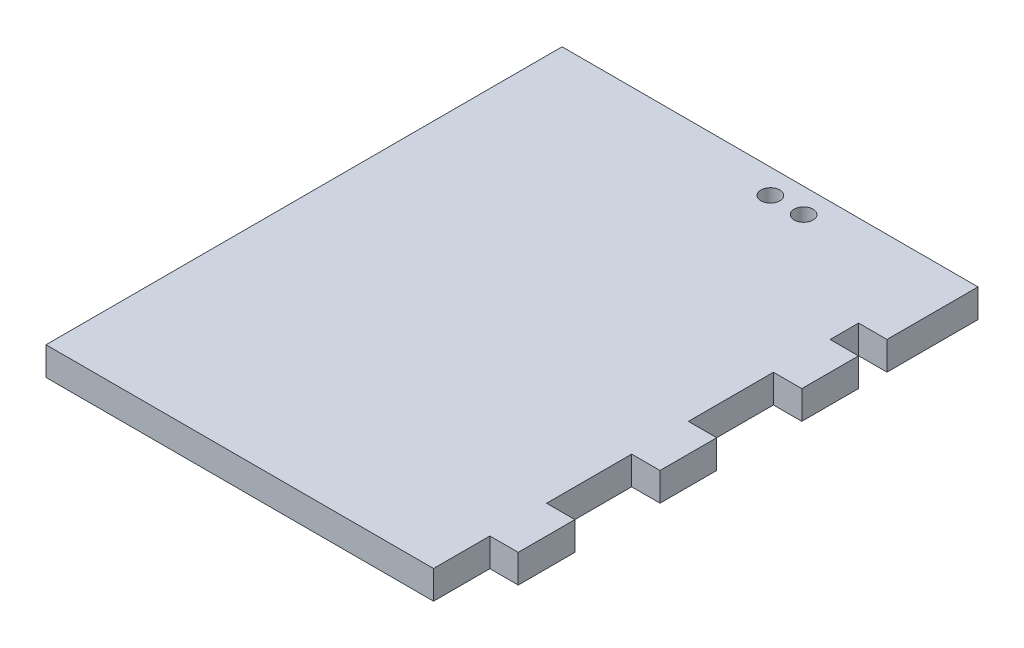
ISO-10303-21;
HEADER;
FILE_DESCRIPTION(('STEP AP214'),'2;1');
FILE_NAME('part.step','',(''),(''),'','','');
FILE_SCHEMA(('AUTOMOTIVE_DESIGN { 1 0 10303 214 1 1 1 1 }'));
ENDSEC;
DATA;
#1=APPLICATION_CONTEXT('core data for automotive mechanical design processes');
#2=APPLICATION_PROTOCOL_DEFINITION('international standard','automotive_design',2000,#1);
#3=PRODUCT_CONTEXT('',#1,'mechanical');
#4=PRODUCT('Part','Part','',(#3));
#5=PRODUCT_RELATED_PRODUCT_CATEGORY('part','',(#4));
#6=PRODUCT_DEFINITION_FORMATION('','',#4);
#7=PRODUCT_DEFINITION_CONTEXT('part definition',#1,'design');
#8=PRODUCT_DEFINITION('design','',#6,#7);
#9=PRODUCT_DEFINITION_SHAPE('','',#8);
#10=(LENGTH_UNIT() NAMED_UNIT(*) SI_UNIT(.MILLI.,.METRE.));
#11=(NAMED_UNIT(*) PLANE_ANGLE_UNIT() SI_UNIT($,.RADIAN.));
#12=(NAMED_UNIT(*) SI_UNIT($,.STERADIAN.) SOLID_ANGLE_UNIT());
#13=UNCERTAINTY_MEASURE_WITH_UNIT(LENGTH_MEASURE(1.E-05),#10,'distance_accuracy_value','');
#14=(GEOMETRIC_REPRESENTATION_CONTEXT(3) GLOBAL_UNCERTAINTY_ASSIGNED_CONTEXT((#13)) GLOBAL_UNIT_ASSIGNED_CONTEXT((#10,
#11,#12)) REPRESENTATION_CONTEXT('',''));
#15=CARTESIAN_POINT('',(0.,0.,0.));
#16=DIRECTION('',(0.,0.,1.));
#17=DIRECTION('',(1.,0.,0.));
#18=AXIS2_PLACEMENT_3D('',#15,#16,#17);
#19=CARTESIAN_POINT('',(22.,3.,-27.3));
#20=DIRECTION('',(-1.,0.,0.));
#21=DIRECTION('',(0.,0.,1.));
#22=AXIS2_PLACEMENT_3D('',#19,#20,#21);
#23=PLANE('',#22);
#24=DIRECTION('',(0.,0.,-1.));
#25=VECTOR('',#24,1.);
#26=CARTESIAN_POINT('',(22.,3.,-27.3));
#27=LINE('',#26,#25);
#28=CARTESIAN_POINT('',(22.,3.,-17.6703269537768));
#29=VERTEX_POINT('',#28);
#30=CARTESIAN_POINT('',(22.,3.,-27.3));
#31=VERTEX_POINT('',#30);
#32=EDGE_CURVE('E195',#29,#31,#27,.T.);
#33=ORIENTED_EDGE('',*,*,#32,.F.);
#34=DIRECTION('',(0.,-1.,0.));
#35=VECTOR('',#34,1.);
#36=CARTESIAN_POINT('',(22.,3.,-17.6703269537768));
#37=LINE('',#36,#35);
#38=CARTESIAN_POINT('',(22.,0.,-17.6703269537768));
#39=VERTEX_POINT('',#38);
#40=EDGE_CURVE('E11',#29,#39,#37,.T.);
#41=ORIENTED_EDGE('',*,*,#40,.T.);
#42=DIRECTION('',(0.,0.,-1.));
#43=VECTOR('',#42,1.);
#44=CARTESIAN_POINT('',(22.,0.,-27.3));
#45=LINE('',#44,#43);
#46=CARTESIAN_POINT('',(22.,0.,-27.3));
#47=VERTEX_POINT('',#46);
#48=EDGE_CURVE('E179',#39,#47,#45,.T.);
#49=ORIENTED_EDGE('',*,*,#48,.T.);
#50=DIRECTION('',(0.,-1.,0.));
#51=VECTOR('',#50,1.);
#52=CARTESIAN_POINT('',(22.,3.,-27.3));
#53=LINE('',#52,#51);
#54=EDGE_CURVE('E202',#31,#47,#53,.T.);
#55=ORIENTED_EDGE('',*,*,#54,.F.);
#56=EDGE_LOOP('',(#33,#41,#49,#55));
#57=FACE_BOUND('',#56,.T.);
#58=ADVANCED_FACE('F33',(#57),#23,.F.);
#59=CARTESIAN_POINT('',(22.,0.,21.3411489454701));
#60=VERTEX_POINT('',#59);
#61=CARTESIAN_POINT('',(22.,0.,15.3411489454701));
#62=VERTEX_POINT('',#61);
#63=EDGE_CURVE('E182',#60,#62,#45,.T.);
#64=ORIENTED_EDGE('',*,*,#63,.T.);
#65=DIRECTION('',(0.,1.,0.));
#66=VECTOR('',#65,1.);
#67=CARTESIAN_POINT('',(22.,3.,15.3411489454701));
#68=LINE('',#67,#66);
#69=CARTESIAN_POINT('',(22.,3.,15.3411489454701));
#70=VERTEX_POINT('',#69);
#71=EDGE_CURVE('E165',#62,#70,#68,.T.);
#72=ORIENTED_EDGE('',*,*,#71,.T.);
#73=CARTESIAN_POINT('',(22.,3.,21.3411489454701));
#74=VERTEX_POINT('',#73);
#75=EDGE_CURVE('E222',#74,#70,#27,.T.);
#76=ORIENTED_EDGE('',*,*,#75,.F.);
#77=DIRECTION('',(0.,-1.,0.));
#78=VECTOR('',#77,1.);
#79=CARTESIAN_POINT('',(22.,10.,21.3411489454701));
#80=LINE('',#79,#78);
#81=EDGE_CURVE('E175',#74,#60,#80,.T.);
#82=ORIENTED_EDGE('',*,*,#81,.T.);
#83=EDGE_LOOP('',(#64,#72,#76,#82));
#84=FACE_BOUND('',#83,.T.);
#85=ADVANCED_FACE('F220',(#84),#23,.F.);
#86=CARTESIAN_POINT('',(22.,3.,6.34114894547008));
#87=VERTEX_POINT('',#86);
#88=CARTESIAN_POINT('',(22.,3.,0.341148945470077));
#89=VERTEX_POINT('',#88);
#90=EDGE_CURVE('E238',#87,#89,#27,.T.);
#91=ORIENTED_EDGE('',*,*,#90,.F.);
#92=DIRECTION('',(0.,-1.,0.));
#93=VECTOR('',#92,1.);
#94=CARTESIAN_POINT('',(22.,3.,6.34114894547008));
#95=LINE('',#94,#93);
#96=CARTESIAN_POINT('',(22.,0.,6.34114894547008));
#97=VERTEX_POINT('',#96);
#98=EDGE_CURVE('E212',#87,#97,#95,.T.);
#99=ORIENTED_EDGE('',*,*,#98,.T.);
#100=CARTESIAN_POINT('',(22.,0.,0.341148945470077));
#101=VERTEX_POINT('',#100);
#102=EDGE_CURVE('E178',#97,#101,#45,.T.);
#103=ORIENTED_EDGE('',*,*,#102,.T.);
#104=DIRECTION('',(0.,1.,0.));
#105=VECTOR('',#104,1.);
#106=CARTESIAN_POINT('',(22.,3.,0.341148945470077));
#107=LINE('',#106,#105);
#108=EDGE_CURVE('E209',#101,#89,#107,.T.);
#109=ORIENTED_EDGE('',*,*,#108,.T.);
#110=EDGE_LOOP('',(#91,#99,#103,#109));
#111=FACE_BOUND('',#110,.T.);
#112=ADVANCED_FACE('F306',(#111),#23,.F.);
#113=CARTESIAN_POINT('',(0.,3.,0.));
#114=DIRECTION('',(0.,1.,0.));
#115=DIRECTION('',(0.,0.,1.));
#116=AXIS2_PLACEMENT_3D('',#113,#114,#115);
#117=PLANE('',#116);
#118=DIRECTION('',(-1.,0.,0.));
#119=VECTOR('',#118,1.);
#120=CARTESIAN_POINT('',(0.,3.,-17.6703269537768));
#121=LINE('',#120,#119);
#122=CARTESIAN_POINT('',(18.9999999999954,3.,-17.6703269537768));
#123=VERTEX_POINT('',#122);
#124=EDGE_CURVE('E265',#29,#123,#121,.T.);
#125=ORIENTED_EDGE('',*,*,#124,.F.);
#126=ORIENTED_EDGE('',*,*,#32,.T.);
#127=DIRECTION('',(-1.,0.,0.));
#128=VECTOR('',#127,1.);
#129=CARTESIAN_POINT('',(-22.,3.,-27.3));
#130=LINE('',#129,#128);
#131=CARTESIAN_POINT('',(-22.,3.,-27.3));
#132=VERTEX_POINT('',#131);
#133=EDGE_CURVE('E237',#31,#132,#130,.T.);
#134=ORIENTED_EDGE('',*,*,#133,.T.);
#135=DIRECTION('',(0.,0.,1.));
#136=VECTOR('',#135,1.);
#137=CARTESIAN_POINT('',(-22.,3.,-27.3));
#138=LINE('',#137,#136);
#139=CARTESIAN_POINT('',(-22.,3.,27.3));
#140=VERTEX_POINT('',#139);
#141=EDGE_CURVE('E240',#132,#140,#138,.T.);
#142=ORIENTED_EDGE('',*,*,#141,.T.);
#143=DIRECTION('',(1.,0.,0.));
#144=VECTOR('',#143,1.);
#145=CARTESIAN_POINT('',(-22.,3.,27.3));
#146=LINE('',#145,#144);
#147=CARTESIAN_POINT('',(18.9999999999954,3.,27.3));
#148=VERTEX_POINT('',#147);
#149=EDGE_CURVE('E186',#140,#148,#146,.T.);
#150=ORIENTED_EDGE('',*,*,#149,.T.);
#151=DIRECTION('',(0.,0.,1.));
#152=VECTOR('',#151,1.);
#153=CARTESIAN_POINT('',(18.9999999999954,3.,0.));
#154=LINE('',#153,#152);
#155=CARTESIAN_POINT('',(18.9999999999954,3.,21.3411489454701));
#156=VERTEX_POINT('',#155);
#157=EDGE_CURVE('E258',#156,#148,#154,.T.);
#158=ORIENTED_EDGE('',*,*,#157,.F.);
#159=DIRECTION('',(-1.,0.,0.));
#160=VECTOR('',#159,1.);
#161=CARTESIAN_POINT('',(0.,3.,21.3411489454701));
#162=LINE('',#161,#160);
#163=EDGE_CURVE('E236',#74,#156,#162,.T.);
#164=ORIENTED_EDGE('',*,*,#163,.F.);
#165=ORIENTED_EDGE('',*,*,#75,.T.);
#166=DIRECTION('',(1.,0.,0.));
#167=VECTOR('',#166,1.);
#168=CARTESIAN_POINT('',(0.,3.,15.3411489454701));
#169=LINE('',#168,#167);
#170=CARTESIAN_POINT('',(18.9999999999954,3.,15.3411489454701));
#171=VERTEX_POINT('',#170);
#172=EDGE_CURVE('E234',#171,#70,#169,.T.);
#173=ORIENTED_EDGE('',*,*,#172,.F.);
#174=DIRECTION('',(0.,0.,1.));
#175=VECTOR('',#174,1.);
#176=CARTESIAN_POINT('',(18.9999999999954,3.,0.));
#177=LINE('',#176,#175);
#178=CARTESIAN_POINT('',(18.9999999999954,3.,6.34114894547008));
#179=VERTEX_POINT('',#178);
#180=EDGE_CURVE('E268',#179,#171,#177,.T.);
#181=ORIENTED_EDGE('',*,*,#180,.F.);
#182=DIRECTION('',(-1.,0.,0.));
#183=VECTOR('',#182,1.);
#184=CARTESIAN_POINT('',(0.,3.,6.34114894547012));
#185=LINE('',#184,#183);
#186=EDGE_CURVE('E256',#87,#179,#185,.T.);
#187=ORIENTED_EDGE('',*,*,#186,.F.);
#188=ORIENTED_EDGE('',*,*,#90,.T.);
#189=DIRECTION('',(1.,0.,0.));
#190=VECTOR('',#189,1.);
#191=CARTESIAN_POINT('',(0.,3.,0.341148945470077));
#192=LINE('',#191,#190);
#193=CARTESIAN_POINT('',(18.9999999999954,3.,0.341148945470077));
#194=VERTEX_POINT('',#193);
#195=EDGE_CURVE('E254',#194,#89,#192,.T.);
#196=ORIENTED_EDGE('',*,*,#195,.F.);
#197=DIRECTION('',(0.,0.,1.));
#198=VECTOR('',#197,1.);
#199=CARTESIAN_POINT('',(18.9999999999954,3.,0.));
#200=LINE('',#199,#198);
#201=CARTESIAN_POINT('',(18.9999999999954,3.,-8.65885105452992));
#202=VERTEX_POINT('',#201);
#203=EDGE_CURVE('E252',#202,#194,#200,.T.);
#204=ORIENTED_EDGE('',*,*,#203,.F.);
#205=DIRECTION('',(-1.,0.,0.));
#206=VECTOR('',#205,1.);
#207=CARTESIAN_POINT('',(0.,3.,-8.6588510545299));
#208=LINE('',#207,#206);
#209=CARTESIAN_POINT('',(22.,3.,-8.65885105452992));
#210=VERTEX_POINT('',#209);
#211=EDGE_CURVE('E250',#210,#202,#208,.T.);
#212=ORIENTED_EDGE('',*,*,#211,.F.);
#213=CARTESIAN_POINT('',(22.,3.,-14.6588510545299));
#214=VERTEX_POINT('',#213);
#215=EDGE_CURVE('E243',#210,#214,#27,.T.);
#216=ORIENTED_EDGE('',*,*,#215,.T.);
#217=DIRECTION('',(1.,0.,0.));
#218=VECTOR('',#217,1.);
#219=CARTESIAN_POINT('',(0.,3.,-14.6588510545299));
#220=LINE('',#219,#218);
#221=CARTESIAN_POINT('',(18.9999999999954,3.,-14.6588510545299));
#222=VERTEX_POINT('',#221);
#223=EDGE_CURVE('E48',#222,#214,#220,.T.);
#224=ORIENTED_EDGE('',*,*,#223,.F.);
#225=DIRECTION('',(0.,0.,1.));
#226=VECTOR('',#225,1.);
#227=CARTESIAN_POINT('',(18.9999999999954,3.,0.));
#228=LINE('',#227,#226);
#229=EDGE_CURVE('E270',#123,#222,#228,.T.);
#230=ORIENTED_EDGE('',*,*,#229,.F.);
#231=EDGE_LOOP('',(#125,#126,#134,#142,#150,#158,#164,#165,#173,#181,#187,#188,#196,#204,#212,
#216,#224,#230));
#232=FACE_BOUND('',#231,.T.);
#233=CARTESIAN_POINT('',(2.63698490091233,3.,-24.7));
#234=DIRECTION('',(0.,1.,0.));
#235=DIRECTION('',(0.,0.,1.));
#236=AXIS2_PLACEMENT_3D('',#233,#234,#235);
#237=CIRCLE('',#236,0.999999999999998);
#238=CARTESIAN_POINT('',(2.63698490091233,3.,-23.7));
#239=VERTEX_POINT('',#238);
#240=EDGE_CURVE('E183',#239,#239,#237,.T.);
#241=ORIENTED_EDGE('',*,*,#240,.F.);
#242=EDGE_LOOP('',(#241));
#243=FACE_BOUND('',#242,.T.);
#244=CARTESIAN_POINT('',(6.15000000000007,3.,-24.7));
#245=DIRECTION('',(0.,1.,0.));
#246=DIRECTION('',(0.,0.,1.));
#247=AXIS2_PLACEMENT_3D('',#244,#245,#246);
#248=CIRCLE('',#247,0.999999999999998);
#249=CARTESIAN_POINT('',(6.15000000000007,3.,-23.7));
#250=VERTEX_POINT('',#249);
#251=EDGE_CURVE('E273',#250,#250,#248,.T.);
#252=ORIENTED_EDGE('',*,*,#251,.F.);
#253=EDGE_LOOP('',(#252));
#254=FACE_BOUND('',#253,.T.);
#255=ADVANCED_FACE('F231',(#232,#243,#254),#117,.T.);
#256=CARTESIAN_POINT('',(0.,0.,0.));
#257=DIRECTION('',(0.,1.,0.));
#258=DIRECTION('',(0.,0.,1.));
#259=AXIS2_PLACEMENT_3D('',#256,#257,#258);
#260=PLANE('',#259);
#261=ORIENTED_EDGE('',*,*,#48,.F.);
#262=DIRECTION('',(1.,0.,0.));
#263=VECTOR('',#262,1.);
#264=CARTESIAN_POINT('',(22.,0.,-17.6703269537768));
#265=LINE('',#264,#263);
#266=CARTESIAN_POINT('',(18.9999999999954,0.,-17.6703269537768));
#267=VERTEX_POINT('',#266);
#268=EDGE_CURVE('E366',#267,#39,#265,.T.);
#269=ORIENTED_EDGE('',*,*,#268,.F.);
#270=DIRECTION('',(0.,0.,-1.));
#271=VECTOR('',#270,1.);
#272=CARTESIAN_POINT('',(18.9999999999954,0.,-17.6703269537768));
#273=LINE('',#272,#271);
#274=CARTESIAN_POINT('',(18.9999999999954,0.,-14.6588510545299));
#275=VERTEX_POINT('',#274);
#276=EDGE_CURVE('E174',#275,#267,#273,.T.);
#277=ORIENTED_EDGE('',*,*,#276,.F.);
#278=DIRECTION('',(-1.,0.,0.));
#279=VECTOR('',#278,1.);
#280=CARTESIAN_POINT('',(22.,0.,-14.6588510545299));
#281=LINE('',#280,#279);
#282=CARTESIAN_POINT('',(22.,0.,-14.6588510545299));
#283=VERTEX_POINT('',#282);
#284=EDGE_CURVE('E159',#283,#275,#281,.T.);
#285=ORIENTED_EDGE('',*,*,#284,.F.);
#286=CARTESIAN_POINT('',(22.,0.,-8.65885105452992));
#287=VERTEX_POINT('',#286);
#288=EDGE_CURVE('E171',#287,#283,#45,.T.);
#289=ORIENTED_EDGE('',*,*,#288,.F.);
#290=DIRECTION('',(1.,0.,0.));
#291=VECTOR('',#290,1.);
#292=CARTESIAN_POINT('',(18.9999999999954,0.,-8.65885105452992));
#293=LINE('',#292,#291);
#294=CARTESIAN_POINT('',(18.9999999999954,0.,-8.65885105452992));
#295=VERTEX_POINT('',#294);
#296=EDGE_CURVE('E56',#295,#287,#293,.T.);
#297=ORIENTED_EDGE('',*,*,#296,.F.);
#298=DIRECTION('',(0.,0.,-1.));
#299=VECTOR('',#298,1.);
#300=CARTESIAN_POINT('',(18.9999999999954,0.,-8.65885105452992));
#301=LINE('',#300,#299);
#302=CARTESIAN_POINT('',(18.9999999999954,0.,0.341148945470077));
#303=VERTEX_POINT('',#302);
#304=EDGE_CURVE('E337',#303,#295,#301,.T.);
#305=ORIENTED_EDGE('',*,*,#304,.F.);
#306=DIRECTION('',(-1.,0.,0.));
#307=VECTOR('',#306,1.);
#308=CARTESIAN_POINT('',(22.,0.,0.341148945470077));
#309=LINE('',#308,#307);
#310=EDGE_CURVE('E354',#101,#303,#309,.T.);
#311=ORIENTED_EDGE('',*,*,#310,.F.);
#312=ORIENTED_EDGE('',*,*,#102,.F.);
#313=DIRECTION('',(1.,0.,0.));
#314=VECTOR('',#313,1.);
#315=CARTESIAN_POINT('',(18.9999999999954,0.,6.34114894547008));
#316=LINE('',#315,#314);
#317=CARTESIAN_POINT('',(18.9999999999954,0.,6.34114894547008));
#318=VERTEX_POINT('',#317);
#319=EDGE_CURVE('E339',#318,#97,#316,.T.);
#320=ORIENTED_EDGE('',*,*,#319,.F.);
#321=DIRECTION('',(0.,0.,-1.));
#322=VECTOR('',#321,1.);
#323=CARTESIAN_POINT('',(18.9999999999954,0.,6.34114894547008));
#324=LINE('',#323,#322);
#325=CARTESIAN_POINT('',(18.9999999999954,0.,15.3411489454701));
#326=VERTEX_POINT('',#325);
#327=EDGE_CURVE('E332',#326,#318,#324,.T.);
#328=ORIENTED_EDGE('',*,*,#327,.F.);
#329=DIRECTION('',(-1.,0.,0.));
#330=VECTOR('',#329,1.);
#331=CARTESIAN_POINT('',(22.,0.,15.3411489454701));
#332=LINE('',#331,#330);
#333=EDGE_CURVE('E335',#62,#326,#332,.T.);
#334=ORIENTED_EDGE('',*,*,#333,.F.);
#335=ORIENTED_EDGE('',*,*,#63,.F.);
#336=DIRECTION('',(1.,0.,0.));
#337=VECTOR('',#336,1.);
#338=CARTESIAN_POINT('',(18.9999999999954,0.,21.3411489454701));
#339=LINE('',#338,#337);
#340=CARTESIAN_POINT('',(18.9999999999954,0.,21.3411489454701));
#341=VERTEX_POINT('',#340);
#342=EDGE_CURVE('E345',#341,#60,#339,.T.);
#343=ORIENTED_EDGE('',*,*,#342,.F.);
#344=DIRECTION('',(0.,0.,-1.));
#345=VECTOR('',#344,1.);
#346=CARTESIAN_POINT('',(18.9999999999954,0.,21.3411489454701));
#347=LINE('',#346,#345);
#348=CARTESIAN_POINT('',(18.9999999999954,0.,27.3));
#349=VERTEX_POINT('',#348);
#350=EDGE_CURVE('E342',#349,#341,#347,.T.);
#351=ORIENTED_EDGE('',*,*,#350,.F.);
#352=DIRECTION('',(1.,0.,0.));
#353=VECTOR('',#352,1.);
#354=CARTESIAN_POINT('',(-22.,0.,27.3));
#355=LINE('',#354,#353);
#356=CARTESIAN_POINT('',(-22.,0.,27.3));
#357=VERTEX_POINT('',#356);
#358=EDGE_CURVE('E192',#357,#349,#355,.T.);
#359=ORIENTED_EDGE('',*,*,#358,.F.);
#360=DIRECTION('',(0.,0.,1.));
#361=VECTOR('',#360,1.);
#362=CARTESIAN_POINT('',(-22.,0.,-27.3));
#363=LINE('',#362,#361);
#364=CARTESIAN_POINT('',(-22.,0.,-27.3));
#365=VERTEX_POINT('',#364);
#366=EDGE_CURVE('E190',#365,#357,#363,.T.);
#367=ORIENTED_EDGE('',*,*,#366,.F.);
#368=DIRECTION('',(-1.,0.,0.));
#369=VECTOR('',#368,1.);
#370=CARTESIAN_POINT('',(-22.,0.,-27.3));
#371=LINE('',#370,#369);
#372=EDGE_CURVE('E188',#47,#365,#371,.T.);
#373=ORIENTED_EDGE('',*,*,#372,.F.);
#374=EDGE_LOOP('',(#261,#269,#277,#285,#289,#297,#305,#311,#312,#320,#328,#334,#335,#343,#351,
#359,#367,#373));
#375=FACE_BOUND('',#374,.T.);
#376=CARTESIAN_POINT('',(2.63698490091233,0.,-24.7));
#377=DIRECTION('',(0.,1.,0.));
#378=DIRECTION('',(0.,0.,1.));
#379=AXIS2_PLACEMENT_3D('',#376,#377,#378);
#380=CIRCLE('',#379,0.999999999999998);
#381=CARTESIAN_POINT('',(2.63698490091233,0.,-23.7));
#382=VERTEX_POINT('',#381);
#383=EDGE_CURVE('E276',#382,#382,#380,.T.);
#384=ORIENTED_EDGE('',*,*,#383,.T.);
#385=EDGE_LOOP('',(#384));
#386=FACE_BOUND('',#385,.T.);
#387=CARTESIAN_POINT('',(6.15000000000007,0.,-24.7));
#388=DIRECTION('',(0.,1.,0.));
#389=DIRECTION('',(0.,0.,1.));
#390=AXIS2_PLACEMENT_3D('',#387,#388,#389);
#391=CIRCLE('',#390,0.999999999999998);
#392=CARTESIAN_POINT('',(6.15000000000007,0.,-23.7));
#393=VERTEX_POINT('',#392);
#394=EDGE_CURVE('E272',#393,#393,#391,.T.);
#395=ORIENTED_EDGE('',*,*,#394,.T.);
#396=EDGE_LOOP('',(#395));
#397=FACE_BOUND('',#396,.T.);
#398=ADVANCED_FACE('F169',(#375,#386,#397),#260,.F.);
#399=ORIENTED_EDGE('',*,*,#288,.T.);
#400=DIRECTION('',(0.,1.,0.));
#401=VECTOR('',#400,1.);
#402=CARTESIAN_POINT('',(22.,3.,-14.6588510545299));
#403=LINE('',#402,#401);
#404=EDGE_CURVE('E41',#283,#214,#403,.T.);
#405=ORIENTED_EDGE('',*,*,#404,.T.);
#406=ORIENTED_EDGE('',*,*,#215,.F.);
#407=DIRECTION('',(0.,-1.,0.));
#408=VECTOR('',#407,1.);
#409=CARTESIAN_POINT('',(22.,3.,-8.65885105452992));
#410=LINE('',#409,#408);
#411=EDGE_CURVE('E177',#210,#287,#410,.T.);
#412=ORIENTED_EDGE('',*,*,#411,.T.);
#413=EDGE_LOOP('',(#399,#405,#406,#412));
#414=FACE_BOUND('',#413,.T.);
#415=ADVANCED_FACE('F35',(#414),#23,.F.);
#416=CARTESIAN_POINT('',(-22.,3.,-27.3));
#417=DIRECTION('',(0.,0.,1.));
#418=DIRECTION('',(1.,0.,0.));
#419=AXIS2_PLACEMENT_3D('',#416,#417,#418);
#420=PLANE('',#419);
#421=ORIENTED_EDGE('',*,*,#372,.T.);
#422=DIRECTION('',(0.,-1.,0.));
#423=VECTOR('',#422,1.);
#424=CARTESIAN_POINT('',(-22.,3.,-27.3));
#425=LINE('',#424,#423);
#426=EDGE_CURVE('E199',#132,#365,#425,.T.);
#427=ORIENTED_EDGE('',*,*,#426,.F.);
#428=ORIENTED_EDGE('',*,*,#133,.F.);
#429=ORIENTED_EDGE('',*,*,#54,.T.);
#430=EDGE_LOOP('',(#421,#427,#428,#429));
#431=FACE_BOUND('',#430,.T.);
#432=ADVANCED_FACE('F308',(#431),#420,.F.);
#433=CARTESIAN_POINT('',(-22.,3.,-27.3));
#434=DIRECTION('',(1.,0.,0.));
#435=DIRECTION('',(0.,0.,-1.));
#436=AXIS2_PLACEMENT_3D('',#433,#434,#435);
#437=PLANE('',#436);
#438=ORIENTED_EDGE('',*,*,#366,.T.);
#439=DIRECTION('',(0.,-1.,0.));
#440=VECTOR('',#439,1.);
#441=CARTESIAN_POINT('',(-22.,3.,27.3));
#442=LINE('',#441,#440);
#443=EDGE_CURVE('E196',#140,#357,#442,.T.);
#444=ORIENTED_EDGE('',*,*,#443,.F.);
#445=ORIENTED_EDGE('',*,*,#141,.F.);
#446=ORIENTED_EDGE('',*,*,#426,.T.);
#447=EDGE_LOOP('',(#438,#444,#445,#446));
#448=FACE_BOUND('',#447,.T.);
#449=ADVANCED_FACE('F297',(#448),#437,.F.);
#450=CARTESIAN_POINT('',(-22.,3.,27.3));
#451=DIRECTION('',(0.,0.,-1.));
#452=DIRECTION('',(-1.,0.,0.));
#453=AXIS2_PLACEMENT_3D('',#450,#451,#452);
#454=PLANE('',#453);
#455=ORIENTED_EDGE('',*,*,#358,.T.);
#456=DIRECTION('',(0.,1.,0.));
#457=VECTOR('',#456,1.);
#458=CARTESIAN_POINT('',(18.9999999999954,3.,27.3));
#459=LINE('',#458,#457);
#460=EDGE_CURVE('E205',#349,#148,#459,.T.);
#461=ORIENTED_EDGE('',*,*,#460,.T.);
#462=ORIENTED_EDGE('',*,*,#149,.F.);
#463=ORIENTED_EDGE('',*,*,#443,.T.);
#464=EDGE_LOOP('',(#455,#461,#462,#463));
#465=FACE_BOUND('',#464,.T.);
#466=ADVANCED_FACE('F287',(#465),#454,.F.);
#467=CARTESIAN_POINT('',(2.63698490091233,3.,-24.7));
#468=DIRECTION('',(0.,-1.,0.));
#469=DIRECTION('',(0.,0.,-1.));
#470=AXIS2_PLACEMENT_3D('',#467,#468,#469);
#471=CYLINDRICAL_SURFACE('',#470,0.999999999999998);
#472=ORIENTED_EDGE('',*,*,#240,.T.);
#473=EDGE_LOOP('',(#472));
#474=FACE_BOUND('',#473,.T.);
#475=ORIENTED_EDGE('',*,*,#383,.F.);
#476=EDGE_LOOP('',(#475));
#477=FACE_BOUND('',#476,.T.);
#478=ADVANCED_FACE('F284',(#474,#477),#471,.F.);
#479=CARTESIAN_POINT('',(6.15000000000007,3.,-24.7));
#480=DIRECTION('',(0.,-1.,0.));
#481=DIRECTION('',(0.,0.,-1.));
#482=AXIS2_PLACEMENT_3D('',#479,#480,#481);
#483=CYLINDRICAL_SURFACE('',#482,0.999999999999998);
#484=ORIENTED_EDGE('',*,*,#251,.T.);
#485=EDGE_LOOP('',(#484));
#486=FACE_BOUND('',#485,.T.);
#487=ORIENTED_EDGE('',*,*,#394,.F.);
#488=EDGE_LOOP('',(#487));
#489=FACE_BOUND('',#488,.T.);
#490=ADVANCED_FACE('F286',(#486,#489),#483,.F.);
#491=CARTESIAN_POINT('',(18.9999999999954,10.,21.3411489454701));
#492=DIRECTION('',(0.,0.,-1.));
#493=DIRECTION('',(-1.,0.,0.));
#494=AXIS2_PLACEMENT_3D('',#491,#492,#493);
#495=PLANE('',#494);
#496=ORIENTED_EDGE('',*,*,#163,.T.);
#497=DIRECTION('',(0.,-1.,0.));
#498=VECTOR('',#497,1.);
#499=CARTESIAN_POINT('',(18.9999999999954,10.,21.3411489454701));
#500=LINE('',#499,#498);
#501=EDGE_CURVE('E348',#156,#341,#500,.T.);
#502=ORIENTED_EDGE('',*,*,#501,.T.);
#503=ORIENTED_EDGE('',*,*,#342,.T.);
#504=ORIENTED_EDGE('',*,*,#81,.F.);
#505=EDGE_LOOP('',(#496,#502,#503,#504));
#506=FACE_BOUND('',#505,.T.);
#507=ADVANCED_FACE('F294',(#506),#495,.F.);
#508=CARTESIAN_POINT('',(18.9999999999954,10.,21.3411489454701));
#509=DIRECTION('',(-1.,0.,0.));
#510=DIRECTION('',(0.,0.,1.));
#511=AXIS2_PLACEMENT_3D('',#508,#509,#510);
#512=PLANE('',#511);
#513=ORIENTED_EDGE('',*,*,#157,.T.);
#514=ORIENTED_EDGE('',*,*,#460,.F.);
#515=ORIENTED_EDGE('',*,*,#350,.T.);
#516=ORIENTED_EDGE('',*,*,#501,.F.);
#517=EDGE_LOOP('',(#513,#514,#515,#516));
#518=FACE_BOUND('',#517,.T.);
#519=ADVANCED_FACE('F392',(#518),#512,.F.);
#520=CARTESIAN_POINT('',(18.9999999999954,10.,-8.65885105452992));
#521=DIRECTION('',(-1.,0.,0.));
#522=DIRECTION('',(0.,0.,1.));
#523=AXIS2_PLACEMENT_3D('',#520,#521,#522);
#524=PLANE('',#523);
#525=ORIENTED_EDGE('',*,*,#203,.T.);
#526=DIRECTION('',(0.,-1.,0.));
#527=VECTOR('',#526,1.);
#528=CARTESIAN_POINT('',(18.9999999999954,10.,0.341148945470077));
#529=LINE('',#528,#527);
#530=EDGE_CURVE('E346',#194,#303,#529,.T.);
#531=ORIENTED_EDGE('',*,*,#530,.T.);
#532=ORIENTED_EDGE('',*,*,#304,.T.);
#533=DIRECTION('',(0.,-1.,0.));
#534=VECTOR('',#533,1.);
#535=CARTESIAN_POINT('',(18.9999999999954,10.,-8.65885105452992));
#536=LINE('',#535,#534);
#537=EDGE_CURVE('E357',#202,#295,#536,.T.);
#538=ORIENTED_EDGE('',*,*,#537,.F.);
#539=EDGE_LOOP('',(#525,#531,#532,#538));
#540=FACE_BOUND('',#539,.T.);
#541=ADVANCED_FACE('F378',(#540),#524,.F.);
#542=CARTESIAN_POINT('',(22.,10.,0.341148945470077));
#543=DIRECTION('',(0.,0.,1.));
#544=DIRECTION('',(1.,0.,0.));
#545=AXIS2_PLACEMENT_3D('',#542,#543,#544);
#546=PLANE('',#545);
#547=ORIENTED_EDGE('',*,*,#195,.T.);
#548=ORIENTED_EDGE('',*,*,#108,.F.);
#549=ORIENTED_EDGE('',*,*,#310,.T.);
#550=ORIENTED_EDGE('',*,*,#530,.F.);
#551=EDGE_LOOP('',(#547,#548,#549,#550));
#552=FACE_BOUND('',#551,.T.);
#553=ADVANCED_FACE('F376',(#552),#546,.F.);
#554=CARTESIAN_POINT('',(18.9999999999954,10.,-8.65885105452992));
#555=DIRECTION('',(0.,0.,-1.));
#556=DIRECTION('',(-1.,0.,0.));
#557=AXIS2_PLACEMENT_3D('',#554,#555,#556);
#558=PLANE('',#557);
#559=ORIENTED_EDGE('',*,*,#211,.T.);
#560=ORIENTED_EDGE('',*,*,#537,.T.);
#561=ORIENTED_EDGE('',*,*,#296,.T.);
#562=ORIENTED_EDGE('',*,*,#411,.F.);
#563=EDGE_LOOP('',(#559,#560,#561,#562));
#564=FACE_BOUND('',#563,.T.);
#565=ADVANCED_FACE('F379',(#564),#558,.F.);
#566=CARTESIAN_POINT('',(18.9999999999954,10.,6.34114894547008));
#567=DIRECTION('',(-1.,0.,0.));
#568=DIRECTION('',(0.,0.,1.));
#569=AXIS2_PLACEMENT_3D('',#566,#567,#568);
#570=PLANE('',#569);
#571=ORIENTED_EDGE('',*,*,#180,.T.);
#572=DIRECTION('',(0.,-1.,0.));
#573=VECTOR('',#572,1.);
#574=CARTESIAN_POINT('',(18.9999999999954,10.,15.3411489454701));
#575=LINE('',#574,#573);
#576=EDGE_CURVE('E334',#171,#326,#575,.T.);
#577=ORIENTED_EDGE('',*,*,#576,.T.);
#578=ORIENTED_EDGE('',*,*,#327,.T.);
#579=DIRECTION('',(0.,-1.,0.));
#580=VECTOR('',#579,1.);
#581=CARTESIAN_POINT('',(18.9999999999954,10.,6.34114894547008));
#582=LINE('',#581,#580);
#583=EDGE_CURVE('E326',#179,#318,#582,.T.);
#584=ORIENTED_EDGE('',*,*,#583,.F.);
#585=EDGE_LOOP('',(#571,#577,#578,#584));
#586=FACE_BOUND('',#585,.T.);
#587=ADVANCED_FACE('F329',(#586),#570,.F.);
#588=CARTESIAN_POINT('',(22.,10.,15.3411489454701));
#589=DIRECTION('',(0.,0.,1.));
#590=DIRECTION('',(1.,0.,0.));
#591=AXIS2_PLACEMENT_3D('',#588,#589,#590);
#592=PLANE('',#591);
#593=ORIENTED_EDGE('',*,*,#172,.T.);
#594=ORIENTED_EDGE('',*,*,#71,.F.);
#595=ORIENTED_EDGE('',*,*,#333,.T.);
#596=ORIENTED_EDGE('',*,*,#576,.F.);
#597=EDGE_LOOP('',(#593,#594,#595,#596));
#598=FACE_BOUND('',#597,.T.);
#599=ADVANCED_FACE('F386',(#598),#592,.F.);
#600=CARTESIAN_POINT('',(18.9999999999954,10.,6.34114894547008));
#601=DIRECTION('',(0.,0.,-1.));
#602=DIRECTION('',(-1.,0.,0.));
#603=AXIS2_PLACEMENT_3D('',#600,#601,#602);
#604=PLANE('',#603);
#605=ORIENTED_EDGE('',*,*,#186,.T.);
#606=ORIENTED_EDGE('',*,*,#583,.T.);
#607=ORIENTED_EDGE('',*,*,#319,.T.);
#608=ORIENTED_EDGE('',*,*,#98,.F.);
#609=EDGE_LOOP('',(#605,#606,#607,#608));
#610=FACE_BOUND('',#609,.T.);
#611=ADVANCED_FACE('F325',(#610),#604,.F.);
#612=CARTESIAN_POINT('',(22.,10.,-17.6703269537768));
#613=DIRECTION('',(0.,0.,-1.));
#614=DIRECTION('',(-1.,0.,0.));
#615=AXIS2_PLACEMENT_3D('',#612,#613,#614);
#616=PLANE('',#615);
#617=ORIENTED_EDGE('',*,*,#124,.T.);
#618=DIRECTION('',(0.,-1.,0.));
#619=VECTOR('',#618,1.);
#620=CARTESIAN_POINT('',(18.9999999999954,10.,-17.6703269537768));
#621=LINE('',#620,#619);
#622=EDGE_CURVE('E359',#123,#267,#621,.T.);
#623=ORIENTED_EDGE('',*,*,#622,.T.);
#624=ORIENTED_EDGE('',*,*,#268,.T.);
#625=ORIENTED_EDGE('',*,*,#40,.F.);
#626=EDGE_LOOP('',(#617,#623,#624,#625));
#627=FACE_BOUND('',#626,.T.);
#628=ADVANCED_FACE('F404',(#627),#616,.F.);
#629=CARTESIAN_POINT('',(18.9999999999954,10.,-17.6703269537768));
#630=DIRECTION('',(-1.,0.,0.));
#631=DIRECTION('',(0.,0.,1.));
#632=AXIS2_PLACEMENT_3D('',#629,#630,#631);
#633=PLANE('',#632);
#634=ORIENTED_EDGE('',*,*,#229,.T.);
#635=DIRECTION('',(0.,-1.,0.));
#636=VECTOR('',#635,1.);
#637=CARTESIAN_POINT('',(18.9999999999954,10.,-14.6588510545299));
#638=LINE('',#637,#636);
#639=EDGE_CURVE('E362',#222,#275,#638,.T.);
#640=ORIENTED_EDGE('',*,*,#639,.T.);
#641=ORIENTED_EDGE('',*,*,#276,.T.);
#642=ORIENTED_EDGE('',*,*,#622,.F.);
#643=EDGE_LOOP('',(#634,#640,#641,#642));
#644=FACE_BOUND('',#643,.T.);
#645=ADVANCED_FACE('F409',(#644),#633,.F.);
#646=CARTESIAN_POINT('',(22.,10.,-14.6588510545299));
#647=DIRECTION('',(0.,0.,1.));
#648=DIRECTION('',(1.,0.,0.));
#649=AXIS2_PLACEMENT_3D('',#646,#647,#648);
#650=PLANE('',#649);
#651=ORIENTED_EDGE('',*,*,#223,.T.);
#652=ORIENTED_EDGE('',*,*,#404,.F.);
#653=ORIENTED_EDGE('',*,*,#284,.T.);
#654=ORIENTED_EDGE('',*,*,#639,.F.);
#655=EDGE_LOOP('',(#651,#652,#653,#654));
#656=FACE_BOUND('',#655,.T.);
#657=ADVANCED_FACE('F158',(#656),#650,.F.);
#658=CLOSED_SHELL('',(#58,#85,#112,#255,#398,#415,#432,#449,#466,#478,#490,#507,#519,#541,#553,
#565,#587,#599,#611,#628,#645,#657));
#659=MANIFOLD_SOLID_BREP('B2',#658);
#660=ADVANCED_BREP_SHAPE_REPRESENTATION('',(#18,#659),#14);
#661=SHAPE_DEFINITION_REPRESENTATION(#9,#660);
ENDSEC;
END-ISO-10303-21;
